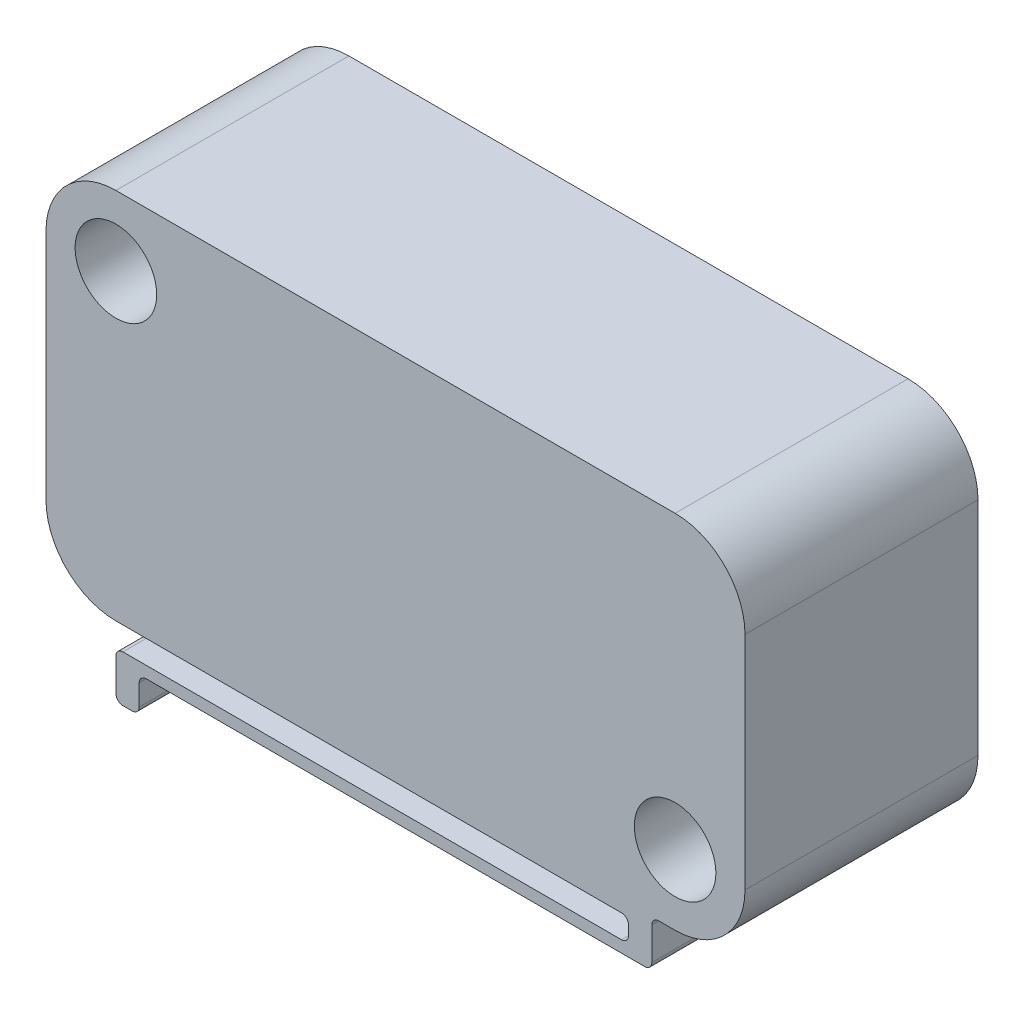
ISO-10303-21;
HEADER;
FILE_DESCRIPTION(('STEP AP214'),'2;1');
FILE_NAME('part.step','',(''),(''),'','','');
FILE_SCHEMA(('AUTOMOTIVE_DESIGN { 1 0 10303 214 1 1 1 1 }'));
ENDSEC;
DATA;
#1=APPLICATION_CONTEXT('core data for automotive mechanical design processes');
#2=APPLICATION_PROTOCOL_DEFINITION('international standard','automotive_design',2000,#1);
#3=PRODUCT_CONTEXT('',#1,'mechanical');
#4=PRODUCT('Part','Part','',(#3));
#5=PRODUCT_RELATED_PRODUCT_CATEGORY('part','',(#4));
#6=PRODUCT_DEFINITION_FORMATION('','',#4);
#7=PRODUCT_DEFINITION_CONTEXT('part definition',#1,'design');
#8=PRODUCT_DEFINITION('design','',#6,#7);
#9=PRODUCT_DEFINITION_SHAPE('','',#8);
#10=(LENGTH_UNIT() NAMED_UNIT(*) SI_UNIT(.MILLI.,.METRE.));
#11=(NAMED_UNIT(*) PLANE_ANGLE_UNIT() SI_UNIT($,.RADIAN.));
#12=(NAMED_UNIT(*) SI_UNIT($,.STERADIAN.) SOLID_ANGLE_UNIT());
#13=UNCERTAINTY_MEASURE_WITH_UNIT(LENGTH_MEASURE(1.E-05),#10,'distance_accuracy_value','');
#14=(GEOMETRIC_REPRESENTATION_CONTEXT(3) GLOBAL_UNCERTAINTY_ASSIGNED_CONTEXT((#13)) GLOBAL_UNIT_ASSIGNED_CONTEXT((#10,
#11,#12)) REPRESENTATION_CONTEXT('',''));
#15=CARTESIAN_POINT('',(0.,0.,0.));
#16=DIRECTION('',(0.,0.,1.));
#17=DIRECTION('',(1.,0.,0.));
#18=AXIS2_PLACEMENT_3D('',#15,#16,#17);
#19=CARTESIAN_POINT('',(27.,13.,10.));
#20=DIRECTION('',(0.,0.,1.));
#21=DIRECTION('',(1.,0.,0.));
#22=AXIS2_PLACEMENT_3D('',#19,#20,#21);
#23=PLANE('',#22);
#24=CARTESIAN_POINT('',(3.,13.,9.99999999999998));
#25=DIRECTION('',(0.,0.,1.));
#26=DIRECTION('',(1.,0.,0.));
#27=AXIS2_PLACEMENT_3D('',#24,#25,#26);
#28=CIRCLE('',#27,1.75);
#29=CARTESIAN_POINT('',(4.75,13.,9.99999999999998));
#30=VERTEX_POINT('',#29);
#31=EDGE_CURVE('E207',#30,#30,#28,.T.);
#32=ORIENTED_EDGE('',*,*,#31,.F.);
#33=EDGE_LOOP('',(#32));
#34=FACE_BOUND('',#33,.T.);
#35=CARTESIAN_POINT('',(27.,13.,10.));
#36=DIRECTION('',(0.,0.,1.));
#37=DIRECTION('',(1.,0.,0.));
#38=AXIS2_PLACEMENT_3D('',#35,#36,#37);
#39=CIRCLE('',#38,3.);
#40=CARTESIAN_POINT('',(30.,13.,10.));
#41=VERTEX_POINT('',#40);
#42=CARTESIAN_POINT('',(27.,16.,10.));
#43=VERTEX_POINT('',#42);
#44=EDGE_CURVE('E279',#41,#43,#39,.T.);
#45=ORIENTED_EDGE('',*,*,#44,.T.);
#46=DIRECTION('',(-1.,0.,0.));
#47=VECTOR('',#46,1.);
#48=CARTESIAN_POINT('',(27.,16.,10.));
#49=LINE('',#48,#47);
#50=CARTESIAN_POINT('',(3.,16.,9.99999999999998));
#51=VERTEX_POINT('',#50);
#52=EDGE_CURVE('E199',#43,#51,#49,.T.);
#53=ORIENTED_EDGE('',*,*,#52,.T.);
#54=CARTESIAN_POINT('',(3.,13.,9.99999999999998));
#55=DIRECTION('',(0.,0.,-1.));
#56=DIRECTION('',(-1.,0.,0.));
#57=AXIS2_PLACEMENT_3D('',#54,#55,#56);
#58=CIRCLE('',#57,3.);
#59=CARTESIAN_POINT('',(0.,13.,9.99999999999998));
#60=VERTEX_POINT('',#59);
#61=EDGE_CURVE('E282',#60,#51,#58,.T.);
#62=ORIENTED_EDGE('',*,*,#61,.F.);
#63=DIRECTION('',(0.,1.,0.));
#64=VECTOR('',#63,1.);
#65=CARTESIAN_POINT('',(0.,3.,10.));
#66=LINE('',#65,#64);
#67=CARTESIAN_POINT('',(0.,3.,10.));
#68=VERTEX_POINT('',#67);
#69=EDGE_CURVE('E285',#68,#60,#66,.T.);
#70=ORIENTED_EDGE('',*,*,#69,.F.);
#71=CARTESIAN_POINT('',(3.,3.,10.));
#72=DIRECTION('',(0.,0.,-1.));
#73=DIRECTION('',(-1.,0.,0.));
#74=AXIS2_PLACEMENT_3D('',#71,#72,#73);
#75=CIRCLE('',#74,3.);
#76=CARTESIAN_POINT('',(3.,0.,9.99999999999998));
#77=VERTEX_POINT('',#76);
#78=EDGE_CURVE('E288',#77,#68,#75,.T.);
#79=ORIENTED_EDGE('',*,*,#78,.F.);
#80=DIRECTION('',(1.,0.,0.));
#81=VECTOR('',#80,1.);
#82=CARTESIAN_POINT('',(3.,0.,9.99999999999998));
#83=LINE('',#82,#81);
#84=CARTESIAN_POINT('',(24.7,0.,9.99999999999998));
#85=VERTEX_POINT('',#84);
#86=EDGE_CURVE('E291',#77,#85,#83,.T.);
#87=ORIENTED_EDGE('',*,*,#86,.T.);
#88=CARTESIAN_POINT('',(24.7,-0.300000000000002,9.99999999999998));
#89=DIRECTION('',(0.,0.,-1.));
#90=DIRECTION('',(-1.,0.,0.));
#91=AXIS2_PLACEMENT_3D('',#88,#89,#90);
#92=CIRCLE('',#91,0.300000000000001);
#93=CARTESIAN_POINT('',(25.,-0.300000000000005,9.99999999999998));
#94=VERTEX_POINT('',#93);
#95=EDGE_CURVE('E294',#85,#94,#92,.T.);
#96=ORIENTED_EDGE('',*,*,#95,.T.);
#97=DIRECTION('',(0.,-1.,0.));
#98=VECTOR('',#97,1.);
#99=CARTESIAN_POINT('',(25.,-0.300000000000005,9.99999999999998));
#100=LINE('',#99,#98);
#101=CARTESIAN_POINT('',(25.,-0.700000000000003,9.99999999999998));
#102=VERTEX_POINT('',#101);
#103=EDGE_CURVE('E297',#94,#102,#100,.T.);
#104=ORIENTED_EDGE('',*,*,#103,.T.);
#105=CARTESIAN_POINT('',(24.7,-0.700000000000003,9.99999999999998));
#106=DIRECTION('',(0.,0.,1.));
#107=DIRECTION('',(1.,0.,0.));
#108=AXIS2_PLACEMENT_3D('',#105,#106,#107);
#109=CIRCLE('',#108,0.300000000000001);
#110=CARTESIAN_POINT('',(24.7,-1.,9.99999999999998));
#111=VERTEX_POINT('',#110);
#112=EDGE_CURVE('E300',#111,#102,#109,.T.);
#113=ORIENTED_EDGE('',*,*,#112,.F.);
#114=DIRECTION('',(-1.,0.,0.));
#115=VECTOR('',#114,1.);
#116=CARTESIAN_POINT('',(24.7,-1.,9.99999999999998));
#117=LINE('',#116,#115);
#118=CARTESIAN_POINT('',(3.30000000000003,-1.,9.99999999999998));
#119=VERTEX_POINT('',#118);
#120=EDGE_CURVE('E303',#111,#119,#117,.T.);
#121=ORIENTED_EDGE('',*,*,#120,.T.);
#122=CARTESIAN_POINT('',(3.29999999999998,-1.3,9.99999999999998));
#123=DIRECTION('',(0.,0.,-1.));
#124=DIRECTION('',(-1.,0.,0.));
#125=AXIS2_PLACEMENT_3D('',#122,#123,#124);
#126=CIRCLE('',#125,0.3);
#127=CARTESIAN_POINT('',(2.99999999999999,-1.3,9.99999999999998));
#128=VERTEX_POINT('',#127);
#129=EDGE_CURVE('E306',#128,#119,#126,.T.);
#130=ORIENTED_EDGE('',*,*,#129,.F.);
#131=DIRECTION('',(0.,-1.,0.));
#132=VECTOR('',#131,1.);
#133=CARTESIAN_POINT('',(2.99999999999999,-1.3,9.99999999999998));
#134=LINE('',#133,#132);
#135=CARTESIAN_POINT('',(2.99999999999999,-2.7,9.99999999999998));
#136=VERTEX_POINT('',#135);
#137=EDGE_CURVE('E309',#128,#136,#134,.T.);
#138=ORIENTED_EDGE('',*,*,#137,.T.);
#139=CARTESIAN_POINT('',(3.30000000000001,-2.7,9.99999999999998));
#140=DIRECTION('',(0.,0.,-1.));
#141=DIRECTION('',(-1.,0.,0.));
#142=AXIS2_PLACEMENT_3D('',#139,#140,#141);
#143=CIRCLE('',#142,0.299999999999999);
#144=CARTESIAN_POINT('',(3.30000000000001,-3.,9.99999999999998));
#145=VERTEX_POINT('',#144);
#146=EDGE_CURVE('E312',#145,#136,#143,.T.);
#147=ORIENTED_EDGE('',*,*,#146,.F.);
#148=DIRECTION('',(1.,0.,0.));
#149=VECTOR('',#148,1.);
#150=CARTESIAN_POINT('',(3.30000000000001,-3.,9.99999999999998));
#151=LINE('',#150,#149);
#152=CARTESIAN_POINT('',(3.69999999999997,-3.,9.99999999999998));
#153=VERTEX_POINT('',#152);
#154=EDGE_CURVE('E315',#145,#153,#151,.T.);
#155=ORIENTED_EDGE('',*,*,#154,.T.);
#156=CARTESIAN_POINT('',(3.69999999999997,-2.7,9.99999999999998));
#157=DIRECTION('',(0.,0.,-1.));
#158=DIRECTION('',(-1.,0.,0.));
#159=AXIS2_PLACEMENT_3D('',#156,#157,#158);
#160=CIRCLE('',#159,0.3);
#161=CARTESIAN_POINT('',(3.99999999999996,-2.70000000000001,9.99999999999998));
#162=VERTEX_POINT('',#161);
#163=EDGE_CURVE('E318',#162,#153,#160,.T.);
#164=ORIENTED_EDGE('',*,*,#163,.F.);
#165=DIRECTION('',(0.,1.,0.));
#166=VECTOR('',#165,1.);
#167=CARTESIAN_POINT('',(3.99999999999996,-2.70000000000001,9.99999999999998));
#168=LINE('',#167,#166);
#169=CARTESIAN_POINT('',(3.99999999999996,-1.8,9.99999999999998));
#170=VERTEX_POINT('',#169);
#171=EDGE_CURVE('E321',#162,#170,#168,.T.);
#172=ORIENTED_EDGE('',*,*,#171,.T.);
#173=CARTESIAN_POINT('',(4.29999999999997,-1.8,9.99999999999998));
#174=DIRECTION('',(0.,0.,-1.));
#175=DIRECTION('',(-1.,0.,0.));
#176=AXIS2_PLACEMENT_3D('',#173,#174,#175);
#177=CIRCLE('',#176,0.3);
#178=CARTESIAN_POINT('',(4.29999999999998,-1.5,9.99999999999998));
#179=VERTEX_POINT('',#178);
#180=EDGE_CURVE('E324',#170,#179,#177,.T.);
#181=ORIENTED_EDGE('',*,*,#180,.T.);
#182=DIRECTION('',(-1.,0.,0.));
#183=VECTOR('',#182,1.);
#184=CARTESIAN_POINT('',(25.7,-1.50000000000001,9.99999999999998));
#185=LINE('',#184,#183);
#186=CARTESIAN_POINT('',(25.7,-1.50000000000001,9.99999999999998));
#187=VERTEX_POINT('',#186);
#188=EDGE_CURVE('E327',#187,#179,#185,.T.);
#189=ORIENTED_EDGE('',*,*,#188,.F.);
#190=CARTESIAN_POINT('',(25.7,-1.2,9.99999999999998));
#191=DIRECTION('',(0.,0.,1.));
#192=DIRECTION('',(1.,0.,0.));
#193=AXIS2_PLACEMENT_3D('',#190,#191,#192);
#194=CIRCLE('',#193,0.300000000000001);
#195=CARTESIAN_POINT('',(26.,-1.20000000000001,9.99999999999998));
#196=VERTEX_POINT('',#195);
#197=EDGE_CURVE('E330',#187,#196,#194,.T.);
#198=ORIENTED_EDGE('',*,*,#197,.T.);
#199=DIRECTION('',(0.,-1.,0.));
#200=VECTOR('',#199,1.);
#201=CARTESIAN_POINT('',(26.,0.199999999999995,9.99999999999998));
#202=LINE('',#201,#200);
#203=CARTESIAN_POINT('',(26.,0.199999999999995,9.99999999999998));
#204=VERTEX_POINT('',#203);
#205=EDGE_CURVE('E333',#204,#196,#202,.T.);
#206=ORIENTED_EDGE('',*,*,#205,.F.);
#207=CARTESIAN_POINT('',(26.3,0.199999999999995,9.99999999999998));
#208=DIRECTION('',(0.,0.,-1.));
#209=DIRECTION('',(-1.,0.,0.));
#210=AXIS2_PLACEMENT_3D('',#207,#208,#209);
#211=CIRCLE('',#210,0.299999999999997);
#212=CARTESIAN_POINT('',(26.3,0.499999999999994,9.99999999999998));
#213=VERTEX_POINT('',#212);
#214=EDGE_CURVE('E336',#204,#213,#211,.T.);
#215=ORIENTED_EDGE('',*,*,#214,.T.);
#216=DIRECTION('',(-1.,0.,0.));
#217=VECTOR('',#216,1.);
#218=CARTESIAN_POINT('',(27.,0.49999999999999,9.99999999999998));
#219=LINE('',#218,#217);
#220=CARTESIAN_POINT('',(27.,0.49999999999999,9.99999999999998));
#221=VERTEX_POINT('',#220);
#222=EDGE_CURVE('E339',#221,#213,#219,.T.);
#223=ORIENTED_EDGE('',*,*,#222,.F.);
#224=CARTESIAN_POINT('',(27.,3.5,9.99999999999998));
#225=DIRECTION('',(0.,0.,-1.));
#226=DIRECTION('',(-1.,0.,0.));
#227=AXIS2_PLACEMENT_3D('',#224,#225,#226);
#228=CIRCLE('',#227,3.);
#229=CARTESIAN_POINT('',(30.,3.49999999999999,9.99999999999998));
#230=VERTEX_POINT('',#229);
#231=EDGE_CURVE('E342',#230,#221,#228,.T.);
#232=ORIENTED_EDGE('',*,*,#231,.F.);
#233=DIRECTION('',(0.,-1.,0.));
#234=VECTOR('',#233,1.);
#235=CARTESIAN_POINT('',(30.,13.,10.));
#236=LINE('',#235,#234);
#237=EDGE_CURVE('E344',#41,#230,#236,.T.);
#238=ORIENTED_EDGE('',*,*,#237,.F.);
#239=EDGE_LOOP('',(#45,#53,#62,#70,#79,#87,#96,#104,#113,#121,#130,#138,#147,#155,#164,#172,
#181,#189,#198,#206,#215,#223,#232,#238));
#240=FACE_BOUND('',#239,.T.);
#241=CARTESIAN_POINT('',(27.,3.5,9.99999999999998));
#242=DIRECTION('',(0.,0.,1.));
#243=DIRECTION('',(1.,0.,0.));
#244=AXIS2_PLACEMENT_3D('',#241,#242,#243);
#245=CIRCLE('',#244,1.75);
#246=CARTESIAN_POINT('',(28.75,3.5,9.99999999999998));
#247=VERTEX_POINT('',#246);
#248=EDGE_CURVE('E703',#247,#247,#245,.T.);
#249=ORIENTED_EDGE('',*,*,#248,.F.);
#250=EDGE_LOOP('',(#249));
#251=FACE_BOUND('',#250,.T.);
#252=ADVANCED_FACE('F32',(#34,#240,#251),#23,.T.);
#253=CARTESIAN_POINT('',(27.,13.,0.));
#254=DIRECTION('',(0.,0.,1.));
#255=DIRECTION('',(1.,0.,0.));
#256=AXIS2_PLACEMENT_3D('',#253,#254,#255);
#257=PLANE('',#256);
#258=CARTESIAN_POINT('',(3.,13.,0.));
#259=DIRECTION('',(0.,0.,1.));
#260=DIRECTION('',(1.,0.,0.));
#261=AXIS2_PLACEMENT_3D('',#258,#259,#260);
#262=CIRCLE('',#261,1.75);
#263=CARTESIAN_POINT('',(4.75,13.,0.));
#264=VERTEX_POINT('',#263);
#265=EDGE_CURVE('E708',#264,#264,#262,.T.);
#266=ORIENTED_EDGE('',*,*,#265,.T.);
#267=EDGE_LOOP('',(#266));
#268=FACE_BOUND('',#267,.T.);
#269=CARTESIAN_POINT('',(27.,13.,0.));
#270=DIRECTION('',(0.,0.,1.));
#271=DIRECTION('',(1.,0.,0.));
#272=AXIS2_PLACEMENT_3D('',#269,#270,#271);
#273=CIRCLE('',#272,3.);
#274=CARTESIAN_POINT('',(30.,13.,0.));
#275=VERTEX_POINT('',#274);
#276=CARTESIAN_POINT('',(27.,16.,0.));
#277=VERTEX_POINT('',#276);
#278=EDGE_CURVE('E203',#275,#277,#273,.T.);
#279=ORIENTED_EDGE('',*,*,#278,.F.);
#280=DIRECTION('',(0.,-1.,0.));
#281=VECTOR('',#280,1.);
#282=CARTESIAN_POINT('',(30.,13.,0.));
#283=LINE('',#282,#281);
#284=CARTESIAN_POINT('',(30.,3.5,0.));
#285=VERTEX_POINT('',#284);
#286=EDGE_CURVE('E277',#275,#285,#283,.T.);
#287=ORIENTED_EDGE('',*,*,#286,.T.);
#288=CARTESIAN_POINT('',(27.,3.5,0.));
#289=DIRECTION('',(0.,0.,-1.));
#290=DIRECTION('',(-1.,0.,0.));
#291=AXIS2_PLACEMENT_3D('',#288,#289,#290);
#292=CIRCLE('',#291,3.);
#293=CARTESIAN_POINT('',(27.,0.499999999999994,0.));
#294=VERTEX_POINT('',#293);
#295=EDGE_CURVE('E274',#285,#294,#292,.T.);
#296=ORIENTED_EDGE('',*,*,#295,.T.);
#297=DIRECTION('',(-1.,0.,0.));
#298=VECTOR('',#297,1.);
#299=CARTESIAN_POINT('',(27.,0.499999999999994,0.));
#300=LINE('',#299,#298);
#301=CARTESIAN_POINT('',(26.3,0.499999999999994,0.));
#302=VERTEX_POINT('',#301);
#303=EDGE_CURVE('E271',#294,#302,#300,.T.);
#304=ORIENTED_EDGE('',*,*,#303,.T.);
#305=CARTESIAN_POINT('',(26.3,0.199999999999995,0.));
#306=DIRECTION('',(0.,0.,-1.));
#307=DIRECTION('',(-1.,0.,0.));
#308=AXIS2_PLACEMENT_3D('',#305,#306,#307);
#309=CIRCLE('',#308,0.299999999999997);
#310=CARTESIAN_POINT('',(26.,0.199999999999995,0.));
#311=VERTEX_POINT('',#310);
#312=EDGE_CURVE('E268',#311,#302,#309,.T.);
#313=ORIENTED_EDGE('',*,*,#312,.F.);
#314=DIRECTION('',(0.,-1.,0.));
#315=VECTOR('',#314,1.);
#316=CARTESIAN_POINT('',(26.,0.199999999999995,0.));
#317=LINE('',#316,#315);
#318=CARTESIAN_POINT('',(26.,-1.20000000000001,0.));
#319=VERTEX_POINT('',#318);
#320=EDGE_CURVE('E265',#311,#319,#317,.T.);
#321=ORIENTED_EDGE('',*,*,#320,.T.);
#322=CARTESIAN_POINT('',(25.7,-1.2,0.));
#323=DIRECTION('',(0.,0.,1.));
#324=DIRECTION('',(1.,0.,0.));
#325=AXIS2_PLACEMENT_3D('',#322,#323,#324);
#326=CIRCLE('',#325,0.300000000000001);
#327=CARTESIAN_POINT('',(25.7,-1.50000000000001,0.));
#328=VERTEX_POINT('',#327);
#329=EDGE_CURVE('E262',#328,#319,#326,.T.);
#330=ORIENTED_EDGE('',*,*,#329,.F.);
#331=DIRECTION('',(-1.,0.,0.));
#332=VECTOR('',#331,1.);
#333=CARTESIAN_POINT('',(25.7,-1.50000000000001,0.));
#334=LINE('',#333,#332);
#335=CARTESIAN_POINT('',(4.29999999999997,-1.5,0.));
#336=VERTEX_POINT('',#335);
#337=EDGE_CURVE('E259',#328,#336,#334,.T.);
#338=ORIENTED_EDGE('',*,*,#337,.T.);
#339=CARTESIAN_POINT('',(4.29999999999996,-1.8,0.));
#340=DIRECTION('',(0.,0.,-1.));
#341=DIRECTION('',(-1.,0.,0.));
#342=AXIS2_PLACEMENT_3D('',#339,#340,#341);
#343=CIRCLE('',#342,0.3);
#344=CARTESIAN_POINT('',(3.99999999999995,-1.8,0.));
#345=VERTEX_POINT('',#344);
#346=EDGE_CURVE('E256',#345,#336,#343,.T.);
#347=ORIENTED_EDGE('',*,*,#346,.F.);
#348=DIRECTION('',(0.,1.,0.));
#349=VECTOR('',#348,1.);
#350=CARTESIAN_POINT('',(3.99999999999998,-2.70000000000001,0.));
#351=LINE('',#350,#349);
#352=CARTESIAN_POINT('',(3.99999999999998,-2.70000000000001,0.));
#353=VERTEX_POINT('',#352);
#354=EDGE_CURVE('E253',#353,#345,#351,.T.);
#355=ORIENTED_EDGE('',*,*,#354,.F.);
#356=CARTESIAN_POINT('',(3.69999999999997,-2.7,0.));
#357=DIRECTION('',(0.,0.,-1.));
#358=DIRECTION('',(-1.,0.,0.));
#359=AXIS2_PLACEMENT_3D('',#356,#357,#358);
#360=CIRCLE('',#359,0.3);
#361=CARTESIAN_POINT('',(3.69999999999997,-3.,0.));
#362=VERTEX_POINT('',#361);
#363=EDGE_CURVE('E250',#353,#362,#360,.T.);
#364=ORIENTED_EDGE('',*,*,#363,.T.);
#365=DIRECTION('',(1.,0.,0.));
#366=VECTOR('',#365,1.);
#367=CARTESIAN_POINT('',(3.30000000000001,-3.,0.));
#368=LINE('',#367,#366);
#369=CARTESIAN_POINT('',(3.30000000000001,-3.,0.));
#370=VERTEX_POINT('',#369);
#371=EDGE_CURVE('E247',#370,#362,#368,.T.);
#372=ORIENTED_EDGE('',*,*,#371,.F.);
#373=CARTESIAN_POINT('',(3.30000000000003,-2.7,0.));
#374=DIRECTION('',(0.,0.,-1.));
#375=DIRECTION('',(-1.,0.,0.));
#376=AXIS2_PLACEMENT_3D('',#373,#374,#375);
#377=CIRCLE('',#376,0.299999999999999);
#378=CARTESIAN_POINT('',(2.99999999999999,-2.7,0.));
#379=VERTEX_POINT('',#378);
#380=EDGE_CURVE('E244',#370,#379,#377,.T.);
#381=ORIENTED_EDGE('',*,*,#380,.T.);
#382=DIRECTION('',(0.,-1.,0.));
#383=VECTOR('',#382,1.);
#384=CARTESIAN_POINT('',(2.99999999999999,-1.3,0.));
#385=LINE('',#384,#383);
#386=CARTESIAN_POINT('',(2.99999999999999,-1.3,0.));
#387=VERTEX_POINT('',#386);
#388=EDGE_CURVE('E241',#387,#379,#385,.T.);
#389=ORIENTED_EDGE('',*,*,#388,.F.);
#390=CARTESIAN_POINT('',(3.30000000000001,-1.3,0.));
#391=DIRECTION('',(0.,0.,-1.));
#392=DIRECTION('',(-1.,0.,0.));
#393=AXIS2_PLACEMENT_3D('',#390,#391,#392);
#394=CIRCLE('',#393,0.3);
#395=CARTESIAN_POINT('',(3.30000000000001,-1.,0.));
#396=VERTEX_POINT('',#395);
#397=EDGE_CURVE('E238',#387,#396,#394,.T.);
#398=ORIENTED_EDGE('',*,*,#397,.T.);
#399=DIRECTION('',(-1.,0.,0.));
#400=VECTOR('',#399,1.);
#401=CARTESIAN_POINT('',(24.7,-1.,0.));
#402=LINE('',#401,#400);
#403=CARTESIAN_POINT('',(24.7,-1.,0.));
#404=VERTEX_POINT('',#403);
#405=EDGE_CURVE('E235',#404,#396,#402,.T.);
#406=ORIENTED_EDGE('',*,*,#405,.F.);
#407=CARTESIAN_POINT('',(24.7,-0.699999999999999,0.));
#408=DIRECTION('',(0.,0.,1.));
#409=DIRECTION('',(1.,0.,0.));
#410=AXIS2_PLACEMENT_3D('',#407,#408,#409);
#411=CIRCLE('',#410,0.300000000000001);
#412=CARTESIAN_POINT('',(25.,-0.700000000000003,0.));
#413=VERTEX_POINT('',#412);
#414=EDGE_CURVE('E232',#404,#413,#411,.T.);
#415=ORIENTED_EDGE('',*,*,#414,.T.);
#416=DIRECTION('',(0.,-1.,0.));
#417=VECTOR('',#416,1.);
#418=CARTESIAN_POINT('',(25.,-0.300000000000005,0.));
#419=LINE('',#418,#417);
#420=CARTESIAN_POINT('',(25.,-0.300000000000005,0.));
#421=VERTEX_POINT('',#420);
#422=EDGE_CURVE('E229',#421,#413,#419,.T.);
#423=ORIENTED_EDGE('',*,*,#422,.F.);
#424=CARTESIAN_POINT('',(24.7,-0.300000000000002,0.));
#425=DIRECTION('',(0.,0.,-1.));
#426=DIRECTION('',(-1.,0.,0.));
#427=AXIS2_PLACEMENT_3D('',#424,#425,#426);
#428=CIRCLE('',#427,0.300000000000001);
#429=CARTESIAN_POINT('',(24.7,0.,0.));
#430=VERTEX_POINT('',#429);
#431=EDGE_CURVE('E226',#430,#421,#428,.T.);
#432=ORIENTED_EDGE('',*,*,#431,.F.);
#433=DIRECTION('',(1.,0.,0.));
#434=VECTOR('',#433,1.);
#435=CARTESIAN_POINT('',(3.00000000000002,0.,0.));
#436=LINE('',#435,#434);
#437=CARTESIAN_POINT('',(3.00000000000002,0.,0.));
#438=VERTEX_POINT('',#437);
#439=EDGE_CURVE('E223',#438,#430,#436,.T.);
#440=ORIENTED_EDGE('',*,*,#439,.F.);
#441=CARTESIAN_POINT('',(3.,3.,0.));
#442=DIRECTION('',(0.,0.,-1.));
#443=DIRECTION('',(-1.,0.,0.));
#444=AXIS2_PLACEMENT_3D('',#441,#442,#443);
#445=CIRCLE('',#444,3.);
#446=CARTESIAN_POINT('',(0.,3.,0.));
#447=VERTEX_POINT('',#446);
#448=EDGE_CURVE('E220',#438,#447,#445,.T.);
#449=ORIENTED_EDGE('',*,*,#448,.T.);
#450=DIRECTION('',(0.,1.,0.));
#451=VECTOR('',#450,1.);
#452=CARTESIAN_POINT('',(0.,3.,0.));
#453=LINE('',#452,#451);
#454=CARTESIAN_POINT('',(0.,13.,0.));
#455=VERTEX_POINT('',#454);
#456=EDGE_CURVE('E215',#447,#455,#453,.T.);
#457=ORIENTED_EDGE('',*,*,#456,.T.);
#458=CARTESIAN_POINT('',(3.,13.,0.));
#459=DIRECTION('',(0.,0.,-1.));
#460=DIRECTION('',(-1.,0.,0.));
#461=AXIS2_PLACEMENT_3D('',#458,#459,#460);
#462=CIRCLE('',#461,3.);
#463=CARTESIAN_POINT('',(3.,16.,0.));
#464=VERTEX_POINT('',#463);
#465=EDGE_CURVE('E213',#455,#464,#462,.T.);
#466=ORIENTED_EDGE('',*,*,#465,.T.);
#467=DIRECTION('',(-1.,0.,0.));
#468=VECTOR('',#467,1.);
#469=CARTESIAN_POINT('',(27.,16.,0.));
#470=LINE('',#469,#468);
#471=EDGE_CURVE('E196',#277,#464,#470,.T.);
#472=ORIENTED_EDGE('',*,*,#471,.F.);
#473=EDGE_LOOP('',(#279,#287,#296,#304,#313,#321,#330,#338,#347,#355,#364,#372,#381,#389,#398,
#406,#415,#423,#432,#440,#449,#457,#466,#472));
#474=FACE_BOUND('',#473,.T.);
#475=CARTESIAN_POINT('',(27.,3.5,0.));
#476=DIRECTION('',(0.,0.,1.));
#477=DIRECTION('',(1.,0.,0.));
#478=AXIS2_PLACEMENT_3D('',#475,#476,#477);
#479=CIRCLE('',#478,1.75);
#480=CARTESIAN_POINT('',(28.75,3.5,0.));
#481=VERTEX_POINT('',#480);
#482=EDGE_CURVE('E706',#481,#481,#479,.T.);
#483=ORIENTED_EDGE('',*,*,#482,.T.);
#484=EDGE_LOOP('',(#483));
#485=FACE_BOUND('',#484,.T.);
#486=ADVANCED_FACE('F209',(#268,#474,#485),#257,.F.);
#487=CARTESIAN_POINT('',(27.,13.,10.));
#488=DIRECTION('',(0.,0.,-1.));
#489=DIRECTION('',(-1.,0.,0.));
#490=AXIS2_PLACEMENT_3D('',#487,#488,#489);
#491=CYLINDRICAL_SURFACE('',#490,3.);
#492=DIRECTION('',(0.,0.,-1.));
#493=VECTOR('',#492,1.);
#494=CARTESIAN_POINT('',(27.,16.,10.));
#495=LINE('',#494,#493);
#496=EDGE_CURVE('E11',#43,#277,#495,.T.);
#497=ORIENTED_EDGE('',*,*,#496,.F.);
#498=ORIENTED_EDGE('',*,*,#44,.F.);
#499=DIRECTION('',(0.,0.,-1.));
#500=VECTOR('',#499,1.);
#501=CARTESIAN_POINT('',(30.,13.,10.));
#502=LINE('',#501,#500);
#503=EDGE_CURVE('E47',#41,#275,#502,.T.);
#504=ORIENTED_EDGE('',*,*,#503,.T.);
#505=ORIENTED_EDGE('',*,*,#278,.T.);
#506=EDGE_LOOP('',(#497,#498,#504,#505));
#507=FACE_BOUND('',#506,.T.);
#508=ADVANCED_FACE('F204',(#507),#491,.T.);
#509=CARTESIAN_POINT('',(27.,16.,10.));
#510=DIRECTION('',(0.,-1.,0.));
#511=DIRECTION('',(0.,0.,-1.));
#512=AXIS2_PLACEMENT_3D('',#509,#510,#511);
#513=PLANE('',#512);
#514=DIRECTION('',(0.,0.,-1.));
#515=VECTOR('',#514,1.);
#516=CARTESIAN_POINT('',(3.,16.,9.99999999999998));
#517=LINE('',#516,#515);
#518=EDGE_CURVE('E40',#51,#464,#517,.T.);
#519=ORIENTED_EDGE('',*,*,#518,.F.);
#520=ORIENTED_EDGE('',*,*,#52,.F.);
#521=ORIENTED_EDGE('',*,*,#496,.T.);
#522=ORIENTED_EDGE('',*,*,#471,.T.);
#523=EDGE_LOOP('',(#519,#520,#521,#522));
#524=FACE_BOUND('',#523,.T.);
#525=ADVANCED_FACE('F34',(#524),#513,.F.);
#526=CARTESIAN_POINT('',(3.,13.,9.99999999999998));
#527=DIRECTION('',(0.,0.,-1.));
#528=DIRECTION('',(-1.,0.,0.));
#529=AXIS2_PLACEMENT_3D('',#526,#527,#528);
#530=CYLINDRICAL_SURFACE('',#529,3.);
#531=DIRECTION('',(0.,0.,-1.));
#532=VECTOR('',#531,1.);
#533=CARTESIAN_POINT('',(0.,13.,9.99999999999998));
#534=LINE('',#533,#532);
#535=EDGE_CURVE('E386',#60,#455,#534,.T.);
#536=ORIENTED_EDGE('',*,*,#535,.F.);
#537=ORIENTED_EDGE('',*,*,#61,.T.);
#538=ORIENTED_EDGE('',*,*,#518,.T.);
#539=ORIENTED_EDGE('',*,*,#465,.F.);
#540=EDGE_LOOP('',(#536,#537,#538,#539));
#541=FACE_BOUND('',#540,.T.);
#542=ADVANCED_FACE('F388',(#541),#530,.T.);
#543=CARTESIAN_POINT('',(0.,3.,10.));
#544=DIRECTION('',(-1.,0.,0.));
#545=DIRECTION('',(0.,0.,1.));
#546=AXIS2_PLACEMENT_3D('',#543,#544,#545);
#547=PLANE('',#546);
#548=DIRECTION('',(0.,0.,-1.));
#549=VECTOR('',#548,1.);
#550=CARTESIAN_POINT('',(0.,3.,10.));
#551=LINE('',#550,#549);
#552=EDGE_CURVE('E384',#68,#447,#551,.T.);
#553=ORIENTED_EDGE('',*,*,#552,.F.);
#554=ORIENTED_EDGE('',*,*,#69,.T.);
#555=ORIENTED_EDGE('',*,*,#535,.T.);
#556=ORIENTED_EDGE('',*,*,#456,.F.);
#557=EDGE_LOOP('',(#553,#554,#555,#556));
#558=FACE_BOUND('',#557,.T.);
#559=ADVANCED_FACE('F470',(#558),#547,.T.);
#560=CARTESIAN_POINT('',(3.,3.,10.));
#561=DIRECTION('',(0.,0.,-1.));
#562=DIRECTION('',(-1.,0.,0.));
#563=AXIS2_PLACEMENT_3D('',#560,#561,#562);
#564=CYLINDRICAL_SURFACE('',#563,3.);
#565=DIRECTION('',(0.,0.,-1.));
#566=VECTOR('',#565,1.);
#567=CARTESIAN_POINT('',(3.,0.,9.99999999999998));
#568=LINE('',#567,#566);
#569=EDGE_CURVE('E382',#77,#438,#568,.T.);
#570=ORIENTED_EDGE('',*,*,#569,.F.);
#571=ORIENTED_EDGE('',*,*,#78,.T.);
#572=ORIENTED_EDGE('',*,*,#552,.T.);
#573=ORIENTED_EDGE('',*,*,#448,.F.);
#574=EDGE_LOOP('',(#570,#571,#572,#573));
#575=FACE_BOUND('',#574,.T.);
#576=ADVANCED_FACE('F467',(#575),#564,.T.);
#577=CARTESIAN_POINT('',(3.,0.,9.99999999999998));
#578=DIRECTION('',(0.,1.,0.));
#579=DIRECTION('',(0.,0.,1.));
#580=AXIS2_PLACEMENT_3D('',#577,#578,#579);
#581=PLANE('',#580);
#582=DIRECTION('',(0.,0.,-1.));
#583=VECTOR('',#582,1.);
#584=CARTESIAN_POINT('',(24.7,0.,9.99999999999998));
#585=LINE('',#584,#583);
#586=EDGE_CURVE('E380',#85,#430,#585,.T.);
#587=ORIENTED_EDGE('',*,*,#586,.F.);
#588=ORIENTED_EDGE('',*,*,#86,.F.);
#589=ORIENTED_EDGE('',*,*,#569,.T.);
#590=ORIENTED_EDGE('',*,*,#439,.T.);
#591=EDGE_LOOP('',(#587,#588,#589,#590));
#592=FACE_BOUND('',#591,.T.);
#593=ADVANCED_FACE('F463',(#592),#581,.F.);
#594=CARTESIAN_POINT('',(24.7,-0.300000000000002,9.99999999999998));
#595=DIRECTION('',(0.,0.,-1.));
#596=DIRECTION('',(-1.,0.,0.));
#597=AXIS2_PLACEMENT_3D('',#594,#595,#596);
#598=CYLINDRICAL_SURFACE('',#597,0.300000000000001);
#599=DIRECTION('',(0.,0.,-1.));
#600=VECTOR('',#599,1.);
#601=CARTESIAN_POINT('',(25.,-0.300000000000005,9.99999999999998));
#602=LINE('',#601,#600);
#603=EDGE_CURVE('E378',#94,#421,#602,.T.);
#604=ORIENTED_EDGE('',*,*,#603,.F.);
#605=ORIENTED_EDGE('',*,*,#95,.F.);
#606=ORIENTED_EDGE('',*,*,#586,.T.);
#607=ORIENTED_EDGE('',*,*,#431,.T.);
#608=EDGE_LOOP('',(#604,#605,#606,#607));
#609=FACE_BOUND('',#608,.T.);
#610=ADVANCED_FACE('F459',(#609),#598,.F.);
#611=CARTESIAN_POINT('',(25.,-0.300000000000005,9.99999999999998));
#612=DIRECTION('',(1.,0.,0.));
#613=DIRECTION('',(0.,0.,-1.));
#614=AXIS2_PLACEMENT_3D('',#611,#612,#613);
#615=PLANE('',#614);
#616=DIRECTION('',(0.,0.,-1.));
#617=VECTOR('',#616,1.);
#618=CARTESIAN_POINT('',(25.,-0.700000000000003,9.99999999999998));
#619=LINE('',#618,#617);
#620=EDGE_CURVE('E376',#102,#413,#619,.T.);
#621=ORIENTED_EDGE('',*,*,#620,.F.);
#622=ORIENTED_EDGE('',*,*,#103,.F.);
#623=ORIENTED_EDGE('',*,*,#603,.T.);
#624=ORIENTED_EDGE('',*,*,#422,.T.);
#625=EDGE_LOOP('',(#621,#622,#623,#624));
#626=FACE_BOUND('',#625,.T.);
#627=ADVANCED_FACE('F455',(#626),#615,.F.);
#628=CARTESIAN_POINT('',(24.7,-0.700000000000003,9.99999999999998));
#629=DIRECTION('',(0.,0.,-1.));
#630=DIRECTION('',(-1.,0.,0.));
#631=AXIS2_PLACEMENT_3D('',#628,#629,#630);
#632=CYLINDRICAL_SURFACE('',#631,0.300000000000001);
#633=DIRECTION('',(0.,0.,-1.));
#634=VECTOR('',#633,1.);
#635=CARTESIAN_POINT('',(24.7,-1.,9.99999999999998));
#636=LINE('',#635,#634);
#637=EDGE_CURVE('E374',#111,#404,#636,.T.);
#638=ORIENTED_EDGE('',*,*,#637,.F.);
#639=ORIENTED_EDGE('',*,*,#112,.T.);
#640=ORIENTED_EDGE('',*,*,#620,.T.);
#641=ORIENTED_EDGE('',*,*,#414,.F.);
#642=EDGE_LOOP('',(#638,#639,#640,#641));
#643=FACE_BOUND('',#642,.T.);
#644=ADVANCED_FACE('F452',(#643),#632,.F.);
#645=CARTESIAN_POINT('',(24.7,-1.,9.99999999999998));
#646=DIRECTION('',(0.,-1.,0.));
#647=DIRECTION('',(1.,0.,0.));
#648=AXIS2_PLACEMENT_3D('',#645,#646,#647);
#649=PLANE('',#648);
#650=DIRECTION('',(0.,0.,-1.));
#651=VECTOR('',#650,1.);
#652=CARTESIAN_POINT('',(3.30000000000003,-1.,9.99999999999998));
#653=LINE('',#652,#651);
#654=EDGE_CURVE('E372',#119,#396,#653,.T.);
#655=ORIENTED_EDGE('',*,*,#654,.F.);
#656=ORIENTED_EDGE('',*,*,#120,.F.);
#657=ORIENTED_EDGE('',*,*,#637,.T.);
#658=ORIENTED_EDGE('',*,*,#405,.T.);
#659=EDGE_LOOP('',(#655,#656,#657,#658));
#660=FACE_BOUND('',#659,.T.);
#661=ADVANCED_FACE('F448',(#660),#649,.F.);
#662=CARTESIAN_POINT('',(3.29999999999998,-1.3,9.99999999999998));
#663=DIRECTION('',(0.,0.,-1.));
#664=DIRECTION('',(-1.,0.,0.));
#665=AXIS2_PLACEMENT_3D('',#662,#663,#664);
#666=CYLINDRICAL_SURFACE('',#665,0.3);
#667=DIRECTION('',(0.,0.,-1.));
#668=VECTOR('',#667,1.);
#669=CARTESIAN_POINT('',(2.99999999999999,-1.3,9.99999999999998));
#670=LINE('',#669,#668);
#671=EDGE_CURVE('E370',#128,#387,#670,.T.);
#672=ORIENTED_EDGE('',*,*,#671,.F.);
#673=ORIENTED_EDGE('',*,*,#129,.T.);
#674=ORIENTED_EDGE('',*,*,#654,.T.);
#675=ORIENTED_EDGE('',*,*,#397,.F.);
#676=EDGE_LOOP('',(#672,#673,#674,#675));
#677=FACE_BOUND('',#676,.T.);
#678=ADVANCED_FACE('F443',(#677),#666,.T.);
#679=CARTESIAN_POINT('',(2.99999999999999,-1.3,9.99999999999998));
#680=DIRECTION('',(1.,0.,0.));
#681=DIRECTION('',(0.,1.,0.));
#682=AXIS2_PLACEMENT_3D('',#679,#680,#681);
#683=PLANE('',#682);
#684=DIRECTION('',(0.,0.,-1.));
#685=VECTOR('',#684,1.);
#686=CARTESIAN_POINT('',(2.99999999999999,-2.7,9.99999999999998));
#687=LINE('',#686,#685);
#688=EDGE_CURVE('E368',#136,#379,#687,.T.);
#689=ORIENTED_EDGE('',*,*,#688,.F.);
#690=ORIENTED_EDGE('',*,*,#137,.F.);
#691=ORIENTED_EDGE('',*,*,#671,.T.);
#692=ORIENTED_EDGE('',*,*,#388,.T.);
#693=EDGE_LOOP('',(#689,#690,#691,#692));
#694=FACE_BOUND('',#693,.T.);
#695=ADVANCED_FACE('F439',(#694),#683,.F.);
#696=CARTESIAN_POINT('',(3.30000000000001,-2.7,9.99999999999998));
#697=DIRECTION('',(0.,0.,-1.));
#698=DIRECTION('',(-1.,0.,0.));
#699=AXIS2_PLACEMENT_3D('',#696,#697,#698);
#700=CYLINDRICAL_SURFACE('',#699,0.299999999999999);
#701=DIRECTION('',(0.,0.,-1.));
#702=VECTOR('',#701,1.);
#703=CARTESIAN_POINT('',(3.30000000000001,-3.,9.99999999999998));
#704=LINE('',#703,#702);
#705=EDGE_CURVE('E366',#145,#370,#704,.T.);
#706=ORIENTED_EDGE('',*,*,#705,.F.);
#707=ORIENTED_EDGE('',*,*,#146,.T.);
#708=ORIENTED_EDGE('',*,*,#688,.T.);
#709=ORIENTED_EDGE('',*,*,#380,.F.);
#710=EDGE_LOOP('',(#706,#707,#708,#709));
#711=FACE_BOUND('',#710,.T.);
#712=ADVANCED_FACE('F435',(#711),#700,.T.);
#713=CARTESIAN_POINT('',(3.30000000000001,-3.,9.99999999999998));
#714=DIRECTION('',(0.,1.,0.));
#715=DIRECTION('',(-1.,0.,0.));
#716=AXIS2_PLACEMENT_3D('',#713,#714,#715);
#717=PLANE('',#716);
#718=DIRECTION('',(0.,0.,-1.));
#719=VECTOR('',#718,1.);
#720=CARTESIAN_POINT('',(3.69999999999997,-3.,9.99999999999998));
#721=LINE('',#720,#719);
#722=EDGE_CURVE('E364',#153,#362,#721,.T.);
#723=ORIENTED_EDGE('',*,*,#722,.F.);
#724=ORIENTED_EDGE('',*,*,#154,.F.);
#725=ORIENTED_EDGE('',*,*,#705,.T.);
#726=ORIENTED_EDGE('',*,*,#371,.T.);
#727=EDGE_LOOP('',(#723,#724,#725,#726));
#728=FACE_BOUND('',#727,.T.);
#729=ADVANCED_FACE('F431',(#728),#717,.F.);
#730=CARTESIAN_POINT('',(3.69999999999997,-2.7,9.99999999999998));
#731=DIRECTION('',(0.,0.,-1.));
#732=DIRECTION('',(-1.,0.,0.));
#733=AXIS2_PLACEMENT_3D('',#730,#731,#732);
#734=CYLINDRICAL_SURFACE('',#733,0.3);
#735=DIRECTION('',(0.,0.,-1.));
#736=VECTOR('',#735,1.);
#737=CARTESIAN_POINT('',(3.99999999999996,-2.70000000000001,9.99999999999998));
#738=LINE('',#737,#736);
#739=EDGE_CURVE('E362',#162,#353,#738,.T.);
#740=ORIENTED_EDGE('',*,*,#739,.F.);
#741=ORIENTED_EDGE('',*,*,#163,.T.);
#742=ORIENTED_EDGE('',*,*,#722,.T.);
#743=ORIENTED_EDGE('',*,*,#363,.F.);
#744=EDGE_LOOP('',(#740,#741,#742,#743));
#745=FACE_BOUND('',#744,.T.);
#746=ADVANCED_FACE('F428',(#745),#734,.T.);
#747=CARTESIAN_POINT('',(3.99999999999996,-2.70000000000001,9.99999999999998));
#748=DIRECTION('',(-1.,0.,0.));
#749=DIRECTION('',(0.,-1.,0.));
#750=AXIS2_PLACEMENT_3D('',#747,#748,#749);
#751=PLANE('',#750);
#752=DIRECTION('',(0.,0.,-1.));
#753=VECTOR('',#752,1.);
#754=CARTESIAN_POINT('',(3.99999999999996,-1.8,9.99999999999998));
#755=LINE('',#754,#753);
#756=EDGE_CURVE('E360',#170,#345,#755,.T.);
#757=ORIENTED_EDGE('',*,*,#756,.F.);
#758=ORIENTED_EDGE('',*,*,#171,.F.);
#759=ORIENTED_EDGE('',*,*,#739,.T.);
#760=ORIENTED_EDGE('',*,*,#354,.T.);
#761=EDGE_LOOP('',(#757,#758,#759,#760));
#762=FACE_BOUND('',#761,.T.);
#763=ADVANCED_FACE('F424',(#762),#751,.F.);
#764=CARTESIAN_POINT('',(4.29999999999997,-1.8,9.99999999999998));
#765=DIRECTION('',(0.,0.,-1.));
#766=DIRECTION('',(-1.,0.,0.));
#767=AXIS2_PLACEMENT_3D('',#764,#765,#766);
#768=CYLINDRICAL_SURFACE('',#767,0.3);
#769=DIRECTION('',(0.,0.,-1.));
#770=VECTOR('',#769,1.);
#771=CARTESIAN_POINT('',(4.29999999999998,-1.5,9.99999999999998));
#772=LINE('',#771,#770);
#773=EDGE_CURVE('E358',#179,#336,#772,.T.);
#774=ORIENTED_EDGE('',*,*,#773,.F.);
#775=ORIENTED_EDGE('',*,*,#180,.F.);
#776=ORIENTED_EDGE('',*,*,#756,.T.);
#777=ORIENTED_EDGE('',*,*,#346,.T.);
#778=EDGE_LOOP('',(#774,#775,#776,#777));
#779=FACE_BOUND('',#778,.T.);
#780=ADVANCED_FACE('F419',(#779),#768,.F.);
#781=CARTESIAN_POINT('',(25.7,-1.50000000000001,9.99999999999998));
#782=DIRECTION('',(0.,-1.,0.));
#783=DIRECTION('',(1.,0.,0.));
#784=AXIS2_PLACEMENT_3D('',#781,#782,#783);
#785=PLANE('',#784);
#786=DIRECTION('',(0.,0.,-1.));
#787=VECTOR('',#786,1.);
#788=CARTESIAN_POINT('',(25.7,-1.50000000000001,9.99999999999998));
#789=LINE('',#788,#787);
#790=EDGE_CURVE('E356',#187,#328,#789,.T.);
#791=ORIENTED_EDGE('',*,*,#790,.F.);
#792=ORIENTED_EDGE('',*,*,#188,.T.);
#793=ORIENTED_EDGE('',*,*,#773,.T.);
#794=ORIENTED_EDGE('',*,*,#337,.F.);
#795=EDGE_LOOP('',(#791,#792,#793,#794));
#796=FACE_BOUND('',#795,.T.);
#797=ADVANCED_FACE('F416',(#796),#785,.T.);
#798=CARTESIAN_POINT('',(25.7,-1.2,9.99999999999998));
#799=DIRECTION('',(0.,0.,-1.));
#800=DIRECTION('',(-1.,0.,0.));
#801=AXIS2_PLACEMENT_3D('',#798,#799,#800);
#802=CYLINDRICAL_SURFACE('',#801,0.300000000000001);
#803=DIRECTION('',(0.,0.,-1.));
#804=VECTOR('',#803,1.);
#805=CARTESIAN_POINT('',(26.,-1.20000000000001,9.99999999999998));
#806=LINE('',#805,#804);
#807=EDGE_CURVE('E354',#196,#319,#806,.T.);
#808=ORIENTED_EDGE('',*,*,#807,.F.);
#809=ORIENTED_EDGE('',*,*,#197,.F.);
#810=ORIENTED_EDGE('',*,*,#790,.T.);
#811=ORIENTED_EDGE('',*,*,#329,.T.);
#812=EDGE_LOOP('',(#808,#809,#810,#811));
#813=FACE_BOUND('',#812,.T.);
#814=ADVANCED_FACE('F412',(#813),#802,.T.);
#815=CARTESIAN_POINT('',(26.,0.199999999999995,9.99999999999998));
#816=DIRECTION('',(1.,0.,0.));
#817=DIRECTION('',(0.,1.,0.));
#818=AXIS2_PLACEMENT_3D('',#815,#816,#817);
#819=PLANE('',#818);
#820=DIRECTION('',(0.,0.,-1.));
#821=VECTOR('',#820,1.);
#822=CARTESIAN_POINT('',(26.,0.199999999999995,9.99999999999998));
#823=LINE('',#822,#821);
#824=EDGE_CURVE('E352',#204,#311,#823,.T.);
#825=ORIENTED_EDGE('',*,*,#824,.F.);
#826=ORIENTED_EDGE('',*,*,#205,.T.);
#827=ORIENTED_EDGE('',*,*,#807,.T.);
#828=ORIENTED_EDGE('',*,*,#320,.F.);
#829=EDGE_LOOP('',(#825,#826,#827,#828));
#830=FACE_BOUND('',#829,.T.);
#831=ADVANCED_FACE('F407',(#830),#819,.T.);
#832=CARTESIAN_POINT('',(26.3,0.199999999999995,9.99999999999998));
#833=DIRECTION('',(0.,0.,-1.));
#834=DIRECTION('',(-1.,0.,0.));
#835=AXIS2_PLACEMENT_3D('',#832,#833,#834);
#836=CYLINDRICAL_SURFACE('',#835,0.299999999999997);
#837=DIRECTION('',(0.,0.,-1.));
#838=VECTOR('',#837,1.);
#839=CARTESIAN_POINT('',(26.3,0.499999999999994,9.99999999999998));
#840=LINE('',#839,#838);
#841=EDGE_CURVE('E350',#213,#302,#840,.T.);
#842=ORIENTED_EDGE('',*,*,#841,.F.);
#843=ORIENTED_EDGE('',*,*,#214,.F.);
#844=ORIENTED_EDGE('',*,*,#824,.T.);
#845=ORIENTED_EDGE('',*,*,#312,.T.);
#846=EDGE_LOOP('',(#842,#843,#844,#845));
#847=FACE_BOUND('',#846,.T.);
#848=ADVANCED_FACE('F403',(#847),#836,.F.);
#849=CARTESIAN_POINT('',(27.,0.49999999999999,9.99999999999998));
#850=DIRECTION('',(0.,-1.,0.));
#851=DIRECTION('',(1.,0.,0.));
#852=AXIS2_PLACEMENT_3D('',#849,#850,#851);
#853=PLANE('',#852);
#854=DIRECTION('',(0.,0.,-1.));
#855=VECTOR('',#854,1.);
#856=CARTESIAN_POINT('',(27.,0.49999999999999,9.99999999999998));
#857=LINE('',#856,#855);
#858=EDGE_CURVE('E348',#221,#294,#857,.T.);
#859=ORIENTED_EDGE('',*,*,#858,.F.);
#860=ORIENTED_EDGE('',*,*,#222,.T.);
#861=ORIENTED_EDGE('',*,*,#841,.T.);
#862=ORIENTED_EDGE('',*,*,#303,.F.);
#863=EDGE_LOOP('',(#859,#860,#861,#862));
#864=FACE_BOUND('',#863,.T.);
#865=ADVANCED_FACE('F400',(#864),#853,.T.);
#866=CARTESIAN_POINT('',(27.,3.5,9.99999999999998));
#867=DIRECTION('',(0.,0.,-1.));
#868=DIRECTION('',(-1.,0.,0.));
#869=AXIS2_PLACEMENT_3D('',#866,#867,#868);
#870=CYLINDRICAL_SURFACE('',#869,3.);
#871=DIRECTION('',(0.,0.,-1.));
#872=VECTOR('',#871,1.);
#873=CARTESIAN_POINT('',(30.,3.49999999999999,9.99999999999998));
#874=LINE('',#873,#872);
#875=EDGE_CURVE('E55',#230,#285,#874,.T.);
#876=ORIENTED_EDGE('',*,*,#875,.F.);
#877=ORIENTED_EDGE('',*,*,#231,.T.);
#878=ORIENTED_EDGE('',*,*,#858,.T.);
#879=ORIENTED_EDGE('',*,*,#295,.F.);
#880=EDGE_LOOP('',(#876,#877,#878,#879));
#881=FACE_BOUND('',#880,.T.);
#882=ADVANCED_FACE('F396',(#881),#870,.T.);
#883=CARTESIAN_POINT('',(30.,13.,10.));
#884=DIRECTION('',(1.,0.,0.));
#885=DIRECTION('',(0.,0.,-1.));
#886=AXIS2_PLACEMENT_3D('',#883,#884,#885);
#887=PLANE('',#886);
#888=ORIENTED_EDGE('',*,*,#237,.T.);
#889=ORIENTED_EDGE('',*,*,#875,.T.);
#890=ORIENTED_EDGE('',*,*,#286,.F.);
#891=ORIENTED_EDGE('',*,*,#503,.F.);
#892=EDGE_LOOP('',(#888,#889,#890,#891));
#893=FACE_BOUND('',#892,.T.);
#894=ADVANCED_FACE('F395',(#893),#887,.T.);
#895=CARTESIAN_POINT('',(3.,13.,9.99999999999998));
#896=DIRECTION('',(0.,0.,-1.));
#897=DIRECTION('',(-1.,0.,0.));
#898=AXIS2_PLACEMENT_3D('',#895,#896,#897);
#899=CYLINDRICAL_SURFACE('',#898,1.75);
#900=ORIENTED_EDGE('',*,*,#31,.T.);
#901=EDGE_LOOP('',(#900));
#902=FACE_BOUND('',#901,.T.);
#903=ORIENTED_EDGE('',*,*,#265,.F.);
#904=EDGE_LOOP('',(#903));
#905=FACE_BOUND('',#904,.T.);
#906=ADVANCED_FACE('F493',(#902,#905),#899,.F.);
#907=CARTESIAN_POINT('',(27.,3.5,9.99999999999998));
#908=DIRECTION('',(0.,0.,-1.));
#909=DIRECTION('',(-1.,0.,0.));
#910=AXIS2_PLACEMENT_3D('',#907,#908,#909);
#911=CYLINDRICAL_SURFACE('',#910,1.75);
#912=ORIENTED_EDGE('',*,*,#248,.T.);
#913=EDGE_LOOP('',(#912));
#914=FACE_BOUND('',#913,.T.);
#915=ORIENTED_EDGE('',*,*,#482,.F.);
#916=EDGE_LOOP('',(#915));
#917=FACE_BOUND('',#916,.T.);
#918=ADVANCED_FACE('F611',(#914,#917),#911,.F.);
#919=CLOSED_SHELL('',(#252,#486,#508,#525,#542,#559,#576,#593,#610,#627,#644,#661,#678,#695,
#712,#729,#746,#763,#780,#797,#814,#831,#848,#865,#882,#894,#906,#918));
#920=MANIFOLD_SOLID_BREP('B2',#919);
#921=ADVANCED_BREP_SHAPE_REPRESENTATION('',(#18,#920),#14);
#922=SHAPE_DEFINITION_REPRESENTATION(#9,#921);
ENDSEC;
END-ISO-10303-21;
